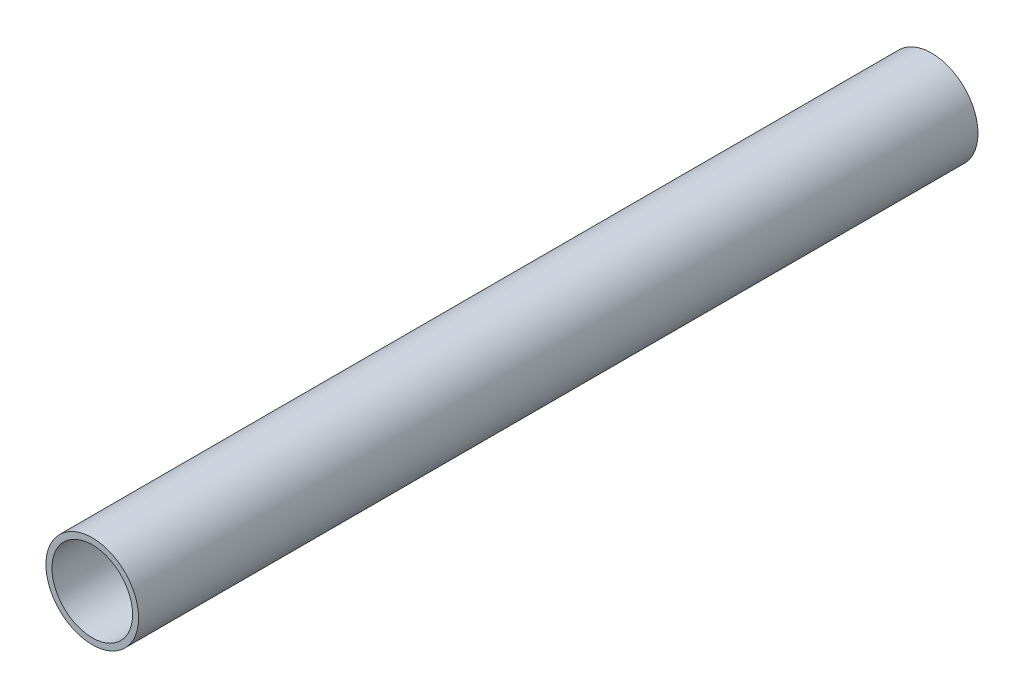
ISO-10303-21;
HEADER;
FILE_DESCRIPTION(('STEP AP214'),'2;1');
FILE_NAME('part.step','',(''),(''),'','','');
FILE_SCHEMA(('AUTOMOTIVE_DESIGN { 1 0 10303 214 1 1 1 1 }'));
ENDSEC;
DATA;
#1=APPLICATION_CONTEXT('core data for automotive mechanical design processes');
#2=APPLICATION_PROTOCOL_DEFINITION('international standard','automotive_design',2000,#1);
#3=PRODUCT_CONTEXT('',#1,'mechanical');
#4=PRODUCT('Part','Part','',(#3));
#5=PRODUCT_RELATED_PRODUCT_CATEGORY('part','',(#4));
#6=PRODUCT_DEFINITION_FORMATION('','',#4);
#7=PRODUCT_DEFINITION_CONTEXT('part definition',#1,'design');
#8=PRODUCT_DEFINITION('design','',#6,#7);
#9=PRODUCT_DEFINITION_SHAPE('','',#8);
#10=(LENGTH_UNIT() NAMED_UNIT(*) SI_UNIT(.MILLI.,.METRE.));
#11=(NAMED_UNIT(*) PLANE_ANGLE_UNIT() SI_UNIT($,.RADIAN.));
#12=(NAMED_UNIT(*) SI_UNIT($,.STERADIAN.) SOLID_ANGLE_UNIT());
#13=UNCERTAINTY_MEASURE_WITH_UNIT(LENGTH_MEASURE(1.E-05),#10,'distance_accuracy_value','');
#14=(GEOMETRIC_REPRESENTATION_CONTEXT(3) GLOBAL_UNCERTAINTY_ASSIGNED_CONTEXT((#13)) GLOBAL_UNIT_ASSIGNED_CONTEXT((#10,
#11,#12)) REPRESENTATION_CONTEXT('',''));
#15=CARTESIAN_POINT('',(0.,0.,0.));
#16=DIRECTION('',(0.,0.,1.));
#17=DIRECTION('',(1.,0.,0.));
#18=AXIS2_PLACEMENT_3D('',#15,#16,#17);
#19=CARTESIAN_POINT('',(0.,0.,762.));
#20=DIRECTION('',(0.,0.,1.));
#21=DIRECTION('',(1.,0.,0.));
#22=AXIS2_PLACEMENT_3D('',#19,#20,#21);
#23=PLANE('',#22);
#24=CARTESIAN_POINT('',(0.,0.,762.));
#25=DIRECTION('',(0.,0.,1.));
#26=DIRECTION('',(1.,0.,0.));
#27=AXIS2_PLACEMENT_3D('',#24,#25,#26);
#28=CIRCLE('',#27,84.1375);
#29=CARTESIAN_POINT('',(84.1375,0.,762.));
#30=VERTEX_POINT('',#29);
#31=EDGE_CURVE('E11',#30,#30,#28,.T.);
#32=ORIENTED_EDGE('',*,*,#31,.T.);
#33=EDGE_LOOP('',(#32));
#34=FACE_BOUND('',#33,.T.);
#35=CARTESIAN_POINT('',(0.,0.,762.));
#36=DIRECTION('',(0.,0.,1.));
#37=DIRECTION('',(1.,0.,0.));
#38=AXIS2_PLACEMENT_3D('',#35,#36,#37);
#39=CIRCLE('',#38,73.1647);
#40=CARTESIAN_POINT('',(73.1647,0.,762.));
#41=VERTEX_POINT('',#40);
#42=EDGE_CURVE('E46',#41,#41,#39,.T.);
#43=ORIENTED_EDGE('',*,*,#42,.F.);
#44=EDGE_LOOP('',(#43));
#45=FACE_BOUND('',#44,.T.);
#46=ADVANCED_FACE('F35',(#34,#45),#23,.T.);
#47=CARTESIAN_POINT('',(0.,0.,-762.));
#48=DIRECTION('',(0.,0.,1.));
#49=DIRECTION('',(1.,0.,0.));
#50=AXIS2_PLACEMENT_3D('',#47,#48,#49);
#51=PLANE('',#50);
#52=CARTESIAN_POINT('',(0.,0.,-762.));
#53=DIRECTION('',(0.,0.,1.));
#54=DIRECTION('',(1.,0.,0.));
#55=AXIS2_PLACEMENT_3D('',#52,#53,#54);
#56=CIRCLE('',#55,84.1375);
#57=CARTESIAN_POINT('',(84.1375,0.,-762.));
#58=VERTEX_POINT('',#57);
#59=EDGE_CURVE('E39',#58,#58,#56,.T.);
#60=ORIENTED_EDGE('',*,*,#59,.F.);
#61=EDGE_LOOP('',(#60));
#62=FACE_BOUND('',#61,.T.);
#63=CARTESIAN_POINT('',(0.,0.,-762.));
#64=DIRECTION('',(0.,0.,1.));
#65=DIRECTION('',(1.,0.,0.));
#66=AXIS2_PLACEMENT_3D('',#63,#64,#65);
#67=CIRCLE('',#66,73.1647);
#68=CARTESIAN_POINT('',(73.1647,0.,-762.));
#69=VERTEX_POINT('',#68);
#70=EDGE_CURVE('E48',#69,#69,#67,.T.);
#71=ORIENTED_EDGE('',*,*,#70,.T.);
#72=EDGE_LOOP('',(#71));
#73=FACE_BOUND('',#72,.T.);
#74=ADVANCED_FACE('F58',(#62,#73),#51,.F.);
#75=CARTESIAN_POINT('',(0.,0.,762.));
#76=DIRECTION('',(0.,0.,-1.));
#77=DIRECTION('',(-1.,0.,0.));
#78=AXIS2_PLACEMENT_3D('',#75,#76,#77);
#79=CYLINDRICAL_SURFACE('',#78,84.1375);
#80=ORIENTED_EDGE('',*,*,#31,.F.);
#81=EDGE_LOOP('',(#80));
#82=FACE_BOUND('',#81,.T.);
#83=ORIENTED_EDGE('',*,*,#59,.T.);
#84=EDGE_LOOP('',(#83));
#85=FACE_BOUND('',#84,.T.);
#86=ADVANCED_FACE('F37',(#82,#85),#79,.T.);
#87=CARTESIAN_POINT('',(0.,0.,762.));
#88=DIRECTION('',(0.,0.,-1.));
#89=DIRECTION('',(-1.,0.,0.));
#90=AXIS2_PLACEMENT_3D('',#87,#88,#89);
#91=CYLINDRICAL_SURFACE('',#90,73.1647);
#92=ORIENTED_EDGE('',*,*,#42,.T.);
#93=EDGE_LOOP('',(#92));
#94=FACE_BOUND('',#93,.T.);
#95=ORIENTED_EDGE('',*,*,#70,.F.);
#96=EDGE_LOOP('',(#95));
#97=FACE_BOUND('',#96,.T.);
#98=ADVANCED_FACE('F54',(#94,#97),#91,.F.);
#99=CLOSED_SHELL('',(#46,#74,#86,#98));
#100=MANIFOLD_SOLID_BREP('B2',#99);
#101=ADVANCED_BREP_SHAPE_REPRESENTATION('',(#18,#100),#14);
#102=SHAPE_DEFINITION_REPRESENTATION(#9,#101);
ENDSEC;
END-ISO-10303-21;
